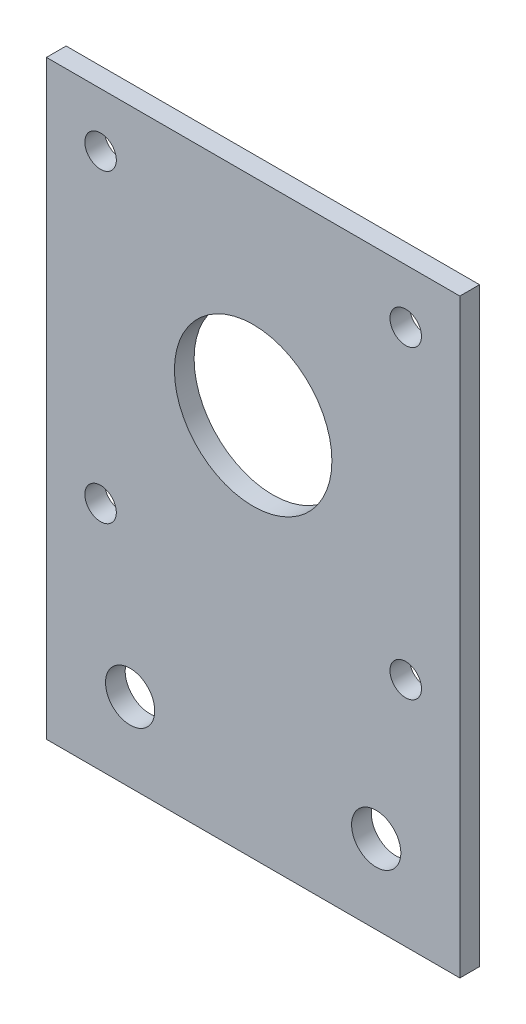
ISO-10303-21;
HEADER;
FILE_DESCRIPTION(('STEP AP214'),'2;1');
FILE_NAME('part.step','',(''),(''),'','','');
FILE_SCHEMA(('AUTOMOTIVE_DESIGN { 1 0 10303 214 1 1 1 1 }'));
ENDSEC;
DATA;
#1=APPLICATION_CONTEXT('core data for automotive mechanical design processes');
#2=APPLICATION_PROTOCOL_DEFINITION('international standard','automotive_design',2000,#1);
#3=PRODUCT_CONTEXT('',#1,'mechanical');
#4=PRODUCT('Part','Part','',(#3));
#5=PRODUCT_RELATED_PRODUCT_CATEGORY('part','',(#4));
#6=PRODUCT_DEFINITION_FORMATION('','',#4);
#7=PRODUCT_DEFINITION_CONTEXT('part definition',#1,'design');
#8=PRODUCT_DEFINITION('design','',#6,#7);
#9=PRODUCT_DEFINITION_SHAPE('','',#8);
#10=(LENGTH_UNIT() NAMED_UNIT(*) SI_UNIT(.MILLI.,.METRE.));
#11=(NAMED_UNIT(*) PLANE_ANGLE_UNIT() SI_UNIT($,.RADIAN.));
#12=(NAMED_UNIT(*) SI_UNIT($,.STERADIAN.) SOLID_ANGLE_UNIT());
#13=UNCERTAINTY_MEASURE_WITH_UNIT(LENGTH_MEASURE(1.E-05),#10,'distance_accuracy_value','');
#14=(GEOMETRIC_REPRESENTATION_CONTEXT(3) GLOBAL_UNCERTAINTY_ASSIGNED_CONTEXT((#13)) GLOBAL_UNIT_ASSIGNED_CONTEXT((#10,
#11,#12)) REPRESENTATION_CONTEXT('',''));
#15=CARTESIAN_POINT('',(0.,0.,0.));
#16=DIRECTION('',(0.,0.,1.));
#17=DIRECTION('',(1.,0.,0.));
#18=AXIS2_PLACEMENT_3D('',#15,#16,#17);
#19=CARTESIAN_POINT('',(0.,0.,2.));
#20=DIRECTION('',(0.,0.,1.));
#21=DIRECTION('',(1.,0.,0.));
#22=AXIS2_PLACEMENT_3D('',#19,#20,#21);
#23=PLANE('',#22);
#24=CARTESIAN_POINT('',(15.5,-15.5,2.));
#25=DIRECTION('',(0.,0.,1.));
#26=DIRECTION('',(-1.,0.,0.));
#27=AXIS2_PLACEMENT_3D('',#24,#25,#26);
#28=CIRCLE('',#27,1.6);
#29=CARTESIAN_POINT('',(13.9,-15.5,2.));
#30=VERTEX_POINT('',#29);
#31=EDGE_CURVE('E142',#30,#30,#28,.T.);
#32=ORIENTED_EDGE('',*,*,#31,.F.);
#33=EDGE_LOOP('',(#32));
#34=FACE_BOUND('',#33,.T.);
#35=CARTESIAN_POINT('',(-12.5,-31.,2.));
#36=DIRECTION('',(0.,0.,1.));
#37=DIRECTION('',(1.,0.,0.));
#38=AXIS2_PLACEMENT_3D('',#35,#36,#37);
#39=CIRCLE('',#38,2.5);
#40=CARTESIAN_POINT('',(-9.99999999999999,-31.,2.));
#41=VERTEX_POINT('',#40);
#42=EDGE_CURVE('E130',#41,#41,#39,.T.);
#43=ORIENTED_EDGE('',*,*,#42,.F.);
#44=EDGE_LOOP('',(#43));
#45=FACE_BOUND('',#44,.T.);
#46=CARTESIAN_POINT('',(-15.5,15.5,2.));
#47=DIRECTION('',(0.,0.,1.));
#48=DIRECTION('',(1.,0.,0.));
#49=AXIS2_PLACEMENT_3D('',#46,#47,#48);
#50=CIRCLE('',#49,1.6);
#51=CARTESIAN_POINT('',(-13.9,15.5,2.));
#52=VERTEX_POINT('',#51);
#53=EDGE_CURVE('E118',#52,#52,#50,.T.);
#54=ORIENTED_EDGE('',*,*,#53,.F.);
#55=EDGE_LOOP('',(#54));
#56=FACE_BOUND('',#55,.T.);
#57=DIRECTION('',(0.,-1.,0.));
#58=VECTOR('',#57,1.);
#59=CARTESIAN_POINT('',(-21.,21.,2.));
#60=LINE('',#59,#58);
#61=CARTESIAN_POINT('',(-21.,21.,2.));
#62=VERTEX_POINT('',#61);
#63=CARTESIAN_POINT('',(-21.,-39.,2.));
#64=VERTEX_POINT('',#63);
#65=EDGE_CURVE('E88',#62,#64,#60,.T.);
#66=ORIENTED_EDGE('',*,*,#65,.T.);
#67=DIRECTION('',(1.,0.,0.));
#68=VECTOR('',#67,1.);
#69=CARTESIAN_POINT('',(-21.,-39.,2.));
#70=LINE('',#69,#68);
#71=CARTESIAN_POINT('',(21.,-39.,2.));
#72=VERTEX_POINT('',#71);
#73=EDGE_CURVE('E83',#64,#72,#70,.T.);
#74=ORIENTED_EDGE('',*,*,#73,.T.);
#75=DIRECTION('',(0.,1.,0.));
#76=VECTOR('',#75,1.);
#77=CARTESIAN_POINT('',(21.,21.,2.));
#78=LINE('',#77,#76);
#79=CARTESIAN_POINT('',(21.,21.,2.));
#80=VERTEX_POINT('',#79);
#81=EDGE_CURVE('E86',#72,#80,#78,.T.);
#82=ORIENTED_EDGE('',*,*,#81,.T.);
#83=DIRECTION('',(-1.,0.,0.));
#84=VECTOR('',#83,1.);
#85=CARTESIAN_POINT('',(21.,21.,2.));
#86=LINE('',#85,#84);
#87=EDGE_CURVE('E53',#80,#62,#86,.T.);
#88=ORIENTED_EDGE('',*,*,#87,.T.);
#89=EDGE_LOOP('',(#66,#74,#82,#88));
#90=FACE_BOUND('',#89,.T.);
#91=CARTESIAN_POINT('',(0.,0.,2.));
#92=DIRECTION('',(0.,0.,1.));
#93=DIRECTION('',(1.,0.,0.));
#94=AXIS2_PLACEMENT_3D('',#91,#92,#93);
#95=CIRCLE('',#94,8.);
#96=CARTESIAN_POINT('',(8.,0.,2.));
#97=VERTEX_POINT('',#96);
#98=EDGE_CURVE('E103',#97,#97,#95,.T.);
#99=ORIENTED_EDGE('',*,*,#98,.F.);
#100=EDGE_LOOP('',(#99));
#101=FACE_BOUND('',#100,.T.);
#102=CARTESIAN_POINT('',(-15.5,-15.5,2.));
#103=DIRECTION('',(0.,0.,1.));
#104=DIRECTION('',(1.,0.,0.));
#105=AXIS2_PLACEMENT_3D('',#102,#103,#104);
#106=CIRCLE('',#105,1.6);
#107=CARTESIAN_POINT('',(-13.9,-15.5,2.));
#108=VERTEX_POINT('',#107);
#109=EDGE_CURVE('E124',#108,#108,#106,.T.);
#110=ORIENTED_EDGE('',*,*,#109,.F.);
#111=EDGE_LOOP('',(#110));
#112=FACE_BOUND('',#111,.T.);
#113=CARTESIAN_POINT('',(15.5,15.5,2.));
#114=DIRECTION('',(0.,0.,1.));
#115=DIRECTION('',(-1.,0.,0.));
#116=AXIS2_PLACEMENT_3D('',#113,#114,#115);
#117=CIRCLE('',#116,1.6);
#118=CARTESIAN_POINT('',(13.9,15.5,2.));
#119=VERTEX_POINT('',#118);
#120=EDGE_CURVE('E136',#119,#119,#117,.T.);
#121=ORIENTED_EDGE('',*,*,#120,.F.);
#122=EDGE_LOOP('',(#121));
#123=FACE_BOUND('',#122,.T.);
#124=CARTESIAN_POINT('',(12.5,-31.,2.));
#125=DIRECTION('',(0.,0.,1.));
#126=DIRECTION('',(-1.,0.,0.));
#127=AXIS2_PLACEMENT_3D('',#124,#125,#126);
#128=CIRCLE('',#127,2.5);
#129=CARTESIAN_POINT('',(9.99999999999999,-31.,2.));
#130=VERTEX_POINT('',#129);
#131=EDGE_CURVE('E148',#130,#130,#128,.T.);
#132=ORIENTED_EDGE('',*,*,#131,.F.);
#133=EDGE_LOOP('',(#132));
#134=FACE_BOUND('',#133,.T.);
#135=ADVANCED_FACE('F36',(#34,#45,#56,#90,#101,#112,#123,#134),#23,.T.);
#136=CARTESIAN_POINT('',(0.,0.,0.));
#137=DIRECTION('',(0.,0.,1.));
#138=DIRECTION('',(1.,0.,0.));
#139=AXIS2_PLACEMENT_3D('',#136,#137,#138);
#140=PLANE('',#139);
#141=DIRECTION('',(0.,-1.,0.));
#142=VECTOR('',#141,1.);
#143=CARTESIAN_POINT('',(-21.,21.,0.));
#144=LINE('',#143,#142);
#145=CARTESIAN_POINT('',(-21.,21.,0.));
#146=VERTEX_POINT('',#145);
#147=CARTESIAN_POINT('',(-21.,-39.,0.));
#148=VERTEX_POINT('',#147);
#149=EDGE_CURVE('E100',#146,#148,#144,.T.);
#150=ORIENTED_EDGE('',*,*,#149,.F.);
#151=DIRECTION('',(-1.,0.,0.));
#152=VECTOR('',#151,1.);
#153=CARTESIAN_POINT('',(21.,21.,0.));
#154=LINE('',#153,#152);
#155=CARTESIAN_POINT('',(21.,21.,0.));
#156=VERTEX_POINT('',#155);
#157=EDGE_CURVE('E76',#156,#146,#154,.T.);
#158=ORIENTED_EDGE('',*,*,#157,.F.);
#159=DIRECTION('',(0.,1.,0.));
#160=VECTOR('',#159,1.);
#161=CARTESIAN_POINT('',(21.,21.,0.));
#162=LINE('',#161,#160);
#163=CARTESIAN_POINT('',(21.,-39.,0.));
#164=VERTEX_POINT('',#163);
#165=EDGE_CURVE('E70',#164,#156,#162,.T.);
#166=ORIENTED_EDGE('',*,*,#165,.F.);
#167=DIRECTION('',(1.,0.,0.));
#168=VECTOR('',#167,1.);
#169=CARTESIAN_POINT('',(-21.,-39.,0.));
#170=LINE('',#169,#168);
#171=EDGE_CURVE('E92',#148,#164,#170,.T.);
#172=ORIENTED_EDGE('',*,*,#171,.F.);
#173=EDGE_LOOP('',(#150,#158,#166,#172));
#174=FACE_BOUND('',#173,.T.);
#175=CARTESIAN_POINT('',(0.,0.,0.));
#176=DIRECTION('',(0.,0.,1.));
#177=DIRECTION('',(1.,0.,0.));
#178=AXIS2_PLACEMENT_3D('',#175,#176,#177);
#179=CIRCLE('',#178,8.);
#180=CARTESIAN_POINT('',(8.,0.,0.));
#181=VERTEX_POINT('',#180);
#182=EDGE_CURVE('E115',#181,#181,#179,.T.);
#183=ORIENTED_EDGE('',*,*,#182,.T.);
#184=EDGE_LOOP('',(#183));
#185=FACE_BOUND('',#184,.T.);
#186=CARTESIAN_POINT('',(-15.5,15.5,0.));
#187=DIRECTION('',(0.,0.,1.));
#188=DIRECTION('',(1.,0.,0.));
#189=AXIS2_PLACEMENT_3D('',#186,#187,#188);
#190=CIRCLE('',#189,1.6);
#191=CARTESIAN_POINT('',(-13.9,15.5,0.));
#192=VERTEX_POINT('',#191);
#193=EDGE_CURVE('E121',#192,#192,#190,.T.);
#194=ORIENTED_EDGE('',*,*,#193,.T.);
#195=EDGE_LOOP('',(#194));
#196=FACE_BOUND('',#195,.T.);
#197=CARTESIAN_POINT('',(-15.5,-15.5,0.));
#198=DIRECTION('',(0.,0.,1.));
#199=DIRECTION('',(1.,0.,0.));
#200=AXIS2_PLACEMENT_3D('',#197,#198,#199);
#201=CIRCLE('',#200,1.6);
#202=CARTESIAN_POINT('',(-13.9,-15.5,0.));
#203=VERTEX_POINT('',#202);
#204=EDGE_CURVE('E127',#203,#203,#201,.T.);
#205=ORIENTED_EDGE('',*,*,#204,.T.);
#206=EDGE_LOOP('',(#205));
#207=FACE_BOUND('',#206,.T.);
#208=CARTESIAN_POINT('',(-12.5,-31.,0.));
#209=DIRECTION('',(0.,0.,1.));
#210=DIRECTION('',(1.,0.,0.));
#211=AXIS2_PLACEMENT_3D('',#208,#209,#210);
#212=CIRCLE('',#211,2.5);
#213=CARTESIAN_POINT('',(-9.99999999999999,-31.,0.));
#214=VERTEX_POINT('',#213);
#215=EDGE_CURVE('E133',#214,#214,#212,.T.);
#216=ORIENTED_EDGE('',*,*,#215,.T.);
#217=EDGE_LOOP('',(#216));
#218=FACE_BOUND('',#217,.T.);
#219=CARTESIAN_POINT('',(15.5,15.5,0.));
#220=DIRECTION('',(0.,0.,1.));
#221=DIRECTION('',(-1.,0.,0.));
#222=AXIS2_PLACEMENT_3D('',#219,#220,#221);
#223=CIRCLE('',#222,1.6);
#224=CARTESIAN_POINT('',(13.9,15.5,0.));
#225=VERTEX_POINT('',#224);
#226=EDGE_CURVE('E139',#225,#225,#223,.T.);
#227=ORIENTED_EDGE('',*,*,#226,.T.);
#228=EDGE_LOOP('',(#227));
#229=FACE_BOUND('',#228,.T.);
#230=CARTESIAN_POINT('',(15.5,-15.5,0.));
#231=DIRECTION('',(0.,0.,1.));
#232=DIRECTION('',(-1.,0.,0.));
#233=AXIS2_PLACEMENT_3D('',#230,#231,#232);
#234=CIRCLE('',#233,1.6);
#235=CARTESIAN_POINT('',(13.9,-15.5,0.));
#236=VERTEX_POINT('',#235);
#237=EDGE_CURVE('E145',#236,#236,#234,.T.);
#238=ORIENTED_EDGE('',*,*,#237,.T.);
#239=EDGE_LOOP('',(#238));
#240=FACE_BOUND('',#239,.T.);
#241=CARTESIAN_POINT('',(12.5,-31.,0.));
#242=DIRECTION('',(0.,0.,1.));
#243=DIRECTION('',(-1.,0.,0.));
#244=AXIS2_PLACEMENT_3D('',#241,#242,#243);
#245=CIRCLE('',#244,2.5);
#246=CARTESIAN_POINT('',(9.99999999999999,-31.,0.));
#247=VERTEX_POINT('',#246);
#248=EDGE_CURVE('E151',#247,#247,#245,.T.);
#249=ORIENTED_EDGE('',*,*,#248,.T.);
#250=EDGE_LOOP('',(#249));
#251=FACE_BOUND('',#250,.T.);
#252=ADVANCED_FACE('F111',(#174,#185,#196,#207,#218,#229,#240,#251),#140,.F.);
#253=CARTESIAN_POINT('',(-21.,21.,2.));
#254=DIRECTION('',(1.,0.,0.));
#255=DIRECTION('',(0.,1.,0.));
#256=AXIS2_PLACEMENT_3D('',#253,#254,#255);
#257=PLANE('',#256);
#258=ORIENTED_EDGE('',*,*,#149,.T.);
#259=DIRECTION('',(0.,0.,-1.));
#260=VECTOR('',#259,1.);
#261=CARTESIAN_POINT('',(-21.,-39.,2.));
#262=LINE('',#261,#260);
#263=EDGE_CURVE('E11',#64,#148,#262,.T.);
#264=ORIENTED_EDGE('',*,*,#263,.F.);
#265=ORIENTED_EDGE('',*,*,#65,.F.);
#266=DIRECTION('',(0.,0.,-1.));
#267=VECTOR('',#266,1.);
#268=CARTESIAN_POINT('',(-21.,21.,2.));
#269=LINE('',#268,#267);
#270=EDGE_CURVE('E96',#62,#146,#269,.T.);
#271=ORIENTED_EDGE('',*,*,#270,.T.);
#272=EDGE_LOOP('',(#258,#264,#265,#271));
#273=FACE_BOUND('',#272,.T.);
#274=ADVANCED_FACE('F38',(#273),#257,.F.);
#275=CARTESIAN_POINT('',(-21.,-39.,2.));
#276=DIRECTION('',(0.,1.,0.));
#277=DIRECTION('',(0.,0.,1.));
#278=AXIS2_PLACEMENT_3D('',#275,#276,#277);
#279=PLANE('',#278);
#280=ORIENTED_EDGE('',*,*,#171,.T.);
#281=DIRECTION('',(0.,0.,-1.));
#282=VECTOR('',#281,1.);
#283=CARTESIAN_POINT('',(21.,-39.,2.));
#284=LINE('',#283,#282);
#285=EDGE_CURVE('E45',#72,#164,#284,.T.);
#286=ORIENTED_EDGE('',*,*,#285,.F.);
#287=ORIENTED_EDGE('',*,*,#73,.F.);
#288=ORIENTED_EDGE('',*,*,#263,.T.);
#289=EDGE_LOOP('',(#280,#286,#287,#288));
#290=FACE_BOUND('',#289,.T.);
#291=ADVANCED_FACE('F91',(#290),#279,.F.);
#292=CARTESIAN_POINT('',(21.,21.,2.));
#293=DIRECTION('',(-1.,0.,0.));
#294=DIRECTION('',(0.,-1.,0.));
#295=AXIS2_PLACEMENT_3D('',#292,#293,#294);
#296=PLANE('',#295);
#297=ORIENTED_EDGE('',*,*,#165,.T.);
#298=DIRECTION('',(0.,0.,-1.));
#299=VECTOR('',#298,1.);
#300=CARTESIAN_POINT('',(21.,21.,2.));
#301=LINE('',#300,#299);
#302=EDGE_CURVE('E93',#80,#156,#301,.T.);
#303=ORIENTED_EDGE('',*,*,#302,.F.);
#304=ORIENTED_EDGE('',*,*,#81,.F.);
#305=ORIENTED_EDGE('',*,*,#285,.T.);
#306=EDGE_LOOP('',(#297,#303,#304,#305));
#307=FACE_BOUND('',#306,.T.);
#308=ADVANCED_FACE('F94',(#307),#296,.F.);
#309=CARTESIAN_POINT('',(21.,21.,2.));
#310=DIRECTION('',(0.,-1.,0.));
#311=DIRECTION('',(0.,0.,-1.));
#312=AXIS2_PLACEMENT_3D('',#309,#310,#311);
#313=PLANE('',#312);
#314=ORIENTED_EDGE('',*,*,#157,.T.);
#315=ORIENTED_EDGE('',*,*,#270,.F.);
#316=ORIENTED_EDGE('',*,*,#87,.F.);
#317=ORIENTED_EDGE('',*,*,#302,.T.);
#318=EDGE_LOOP('',(#314,#315,#316,#317));
#319=FACE_BOUND('',#318,.T.);
#320=ADVANCED_FACE('F108',(#319),#313,.F.);
#321=CARTESIAN_POINT('',(0.,0.,2.));
#322=DIRECTION('',(0.,0.,-1.));
#323=DIRECTION('',(-1.,0.,0.));
#324=AXIS2_PLACEMENT_3D('',#321,#322,#323);
#325=CYLINDRICAL_SURFACE('',#324,8.);
#326=ORIENTED_EDGE('',*,*,#98,.T.);
#327=EDGE_LOOP('',(#326));
#328=FACE_BOUND('',#327,.T.);
#329=ORIENTED_EDGE('',*,*,#182,.F.);
#330=EDGE_LOOP('',(#329));
#331=FACE_BOUND('',#330,.T.);
#332=ADVANCED_FACE('F170',(#328,#331),#325,.F.);
#333=CARTESIAN_POINT('',(-15.5,15.5,2.));
#334=DIRECTION('',(0.,0.,-1.));
#335=DIRECTION('',(-1.,0.,0.));
#336=AXIS2_PLACEMENT_3D('',#333,#334,#335);
#337=CYLINDRICAL_SURFACE('',#336,1.6);
#338=ORIENTED_EDGE('',*,*,#53,.T.);
#339=EDGE_LOOP('',(#338));
#340=FACE_BOUND('',#339,.T.);
#341=ORIENTED_EDGE('',*,*,#193,.F.);
#342=EDGE_LOOP('',(#341));
#343=FACE_BOUND('',#342,.T.);
#344=ADVANCED_FACE('F216',(#340,#343),#337,.F.);
#345=CARTESIAN_POINT('',(-15.5,-15.5,2.));
#346=DIRECTION('',(0.,0.,-1.));
#347=DIRECTION('',(-1.,0.,0.));
#348=AXIS2_PLACEMENT_3D('',#345,#346,#347);
#349=CYLINDRICAL_SURFACE('',#348,1.6);
#350=ORIENTED_EDGE('',*,*,#109,.T.);
#351=EDGE_LOOP('',(#350));
#352=FACE_BOUND('',#351,.T.);
#353=ORIENTED_EDGE('',*,*,#204,.F.);
#354=EDGE_LOOP('',(#353));
#355=FACE_BOUND('',#354,.T.);
#356=ADVANCED_FACE('F224',(#352,#355),#349,.F.);
#357=CARTESIAN_POINT('',(-12.5,-31.,2.));
#358=DIRECTION('',(0.,0.,-1.));
#359=DIRECTION('',(-1.,0.,0.));
#360=AXIS2_PLACEMENT_3D('',#357,#358,#359);
#361=CYLINDRICAL_SURFACE('',#360,2.5);
#362=ORIENTED_EDGE('',*,*,#42,.T.);
#363=EDGE_LOOP('',(#362));
#364=FACE_BOUND('',#363,.T.);
#365=ORIENTED_EDGE('',*,*,#215,.F.);
#366=EDGE_LOOP('',(#365));
#367=FACE_BOUND('',#366,.T.);
#368=ADVANCED_FACE('F232',(#364,#367),#361,.F.);
#369=CARTESIAN_POINT('',(15.5,15.5,2.));
#370=DIRECTION('',(0.,0.,-1.));
#371=DIRECTION('',(-1.,0.,0.));
#372=AXIS2_PLACEMENT_3D('',#369,#370,#371);
#373=CYLINDRICAL_SURFACE('',#372,1.6);
#374=ORIENTED_EDGE('',*,*,#120,.T.);
#375=EDGE_LOOP('',(#374));
#376=FACE_BOUND('',#375,.T.);
#377=ORIENTED_EDGE('',*,*,#226,.F.);
#378=EDGE_LOOP('',(#377));
#379=FACE_BOUND('',#378,.T.);
#380=ADVANCED_FACE('F241',(#376,#379),#373,.F.);
#381=CARTESIAN_POINT('',(15.5,-15.5,2.));
#382=DIRECTION('',(0.,0.,-1.));
#383=DIRECTION('',(-1.,0.,0.));
#384=AXIS2_PLACEMENT_3D('',#381,#382,#383);
#385=CYLINDRICAL_SURFACE('',#384,1.6);
#386=ORIENTED_EDGE('',*,*,#31,.T.);
#387=EDGE_LOOP('',(#386));
#388=FACE_BOUND('',#387,.T.);
#389=ORIENTED_EDGE('',*,*,#237,.F.);
#390=EDGE_LOOP('',(#389));
#391=FACE_BOUND('',#390,.T.);
#392=ADVANCED_FACE('F250',(#388,#391),#385,.F.);
#393=CARTESIAN_POINT('',(12.5,-31.,2.));
#394=DIRECTION('',(0.,0.,-1.));
#395=DIRECTION('',(-1.,0.,0.));
#396=AXIS2_PLACEMENT_3D('',#393,#394,#395);
#397=CYLINDRICAL_SURFACE('',#396,2.5);
#398=ORIENTED_EDGE('',*,*,#131,.T.);
#399=EDGE_LOOP('',(#398));
#400=FACE_BOUND('',#399,.T.);
#401=ORIENTED_EDGE('',*,*,#248,.F.);
#402=EDGE_LOOP('',(#401));
#403=FACE_BOUND('',#402,.T.);
#404=ADVANCED_FACE('F157',(#400,#403),#397,.F.);
#405=CLOSED_SHELL('',(#135,#252,#274,#291,#308,#320,#332,#344,#356,#368,#380,#392,#404));
#406=MANIFOLD_SOLID_BREP('B2',#405);
#407=ADVANCED_BREP_SHAPE_REPRESENTATION('',(#18,#406),#14);
#408=SHAPE_DEFINITION_REPRESENTATION(#9,#407);
ENDSEC;
END-ISO-10303-21;
